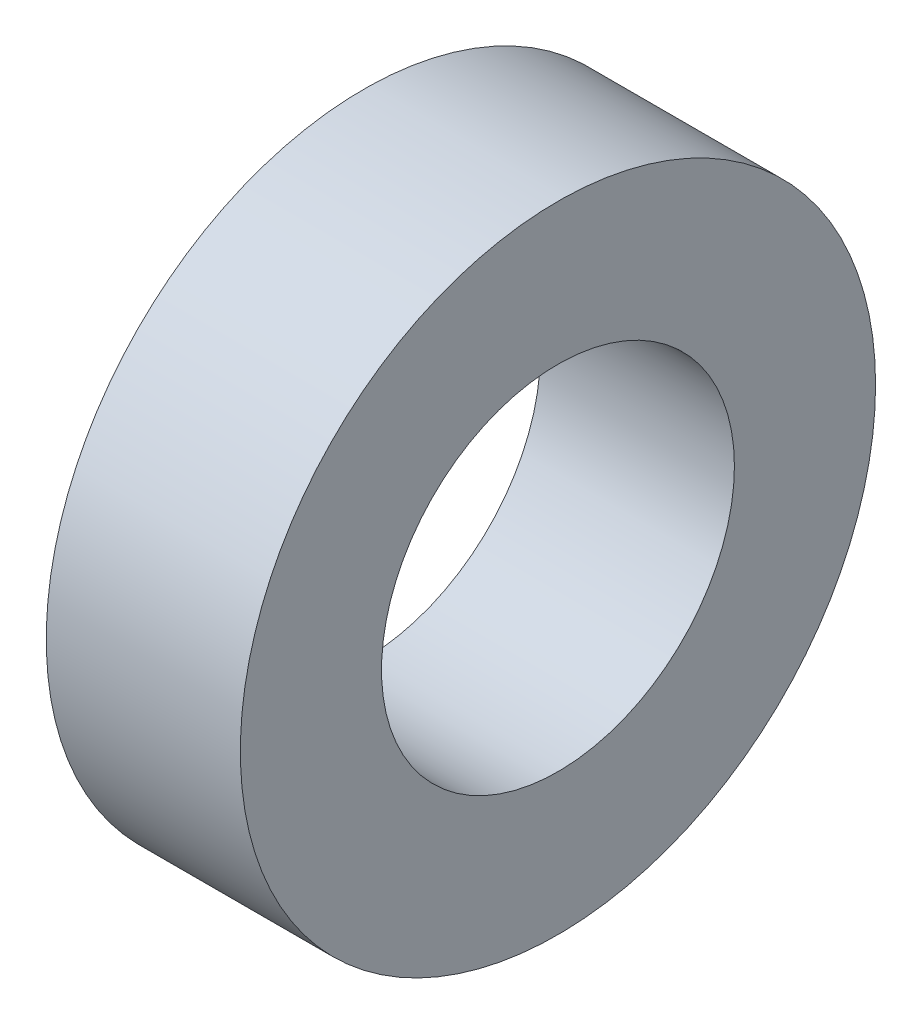
ISO-10303-21;
HEADER;
FILE_DESCRIPTION(('STEP AP214'),'2;1');
FILE_NAME('part.step','',(''),(''),'','','');
FILE_SCHEMA(('AUTOMOTIVE_DESIGN { 1 0 10303 214 1 1 1 1 }'));
ENDSEC;
DATA;
#1=APPLICATION_CONTEXT('core data for automotive mechanical design processes');
#2=APPLICATION_PROTOCOL_DEFINITION('international standard','automotive_design',2000,#1);
#3=PRODUCT_CONTEXT('',#1,'mechanical');
#4=PRODUCT('Part','Part','',(#3));
#5=PRODUCT_RELATED_PRODUCT_CATEGORY('part','',(#4));
#6=PRODUCT_DEFINITION_FORMATION('','',#4);
#7=PRODUCT_DEFINITION_CONTEXT('part definition',#1,'design');
#8=PRODUCT_DEFINITION('design','',#6,#7);
#9=PRODUCT_DEFINITION_SHAPE('','',#8);
#10=(LENGTH_UNIT() NAMED_UNIT(*) SI_UNIT(.MILLI.,.METRE.));
#11=(NAMED_UNIT(*) PLANE_ANGLE_UNIT() SI_UNIT($,.RADIAN.));
#12=(NAMED_UNIT(*) SI_UNIT($,.STERADIAN.) SOLID_ANGLE_UNIT());
#13=UNCERTAINTY_MEASURE_WITH_UNIT(LENGTH_MEASURE(1.E-05),#10,'distance_accuracy_value','');
#14=(GEOMETRIC_REPRESENTATION_CONTEXT(3) GLOBAL_UNCERTAINTY_ASSIGNED_CONTEXT((#13)) GLOBAL_UNIT_ASSIGNED_CONTEXT((#10,
#11,#12)) REPRESENTATION_CONTEXT('',''));
#15=CARTESIAN_POINT('',(0.,0.,0.));
#16=DIRECTION('',(0.,0.,1.));
#17=DIRECTION('',(1.,0.,0.));
#18=AXIS2_PLACEMENT_3D('',#15,#16,#17);
#19=CARTESIAN_POINT('',(-4.9,-1.4,0.));
#20=DIRECTION('',(-1.,0.,0.));
#21=DIRECTION('',(0.,0.,1.));
#22=AXIS2_PLACEMENT_3D('',#19,#20,#21);
#23=PLANE('',#22);
#24=CARTESIAN_POINT('',(-4.9,0.,0.));
#25=DIRECTION('',(1.,0.,0.));
#26=DIRECTION('',(0.,0.,-1.));
#27=AXIS2_PLACEMENT_3D('',#24,#25,#26);
#28=CIRCLE('',#27,1.8);
#29=CARTESIAN_POINT('',(-4.9,0.,-1.8));
#30=VERTEX_POINT('',#29);
#31=EDGE_CURVE('E17',#30,#30,#28,.T.);
#32=ORIENTED_EDGE('',*,*,#31,.F.);
#33=EDGE_LOOP('',(#32));
#34=FACE_BOUND('',#33,.T.);
#35=CARTESIAN_POINT('',(-4.9,0.,0.));
#36=DIRECTION('',(1.,0.,0.));
#37=DIRECTION('',(0.,0.,-1.));
#38=AXIS2_PLACEMENT_3D('',#35,#36,#37);
#39=CIRCLE('',#38,1.);
#40=CARTESIAN_POINT('',(-4.9,0.,-1.));
#41=VERTEX_POINT('',#40);
#42=EDGE_CURVE('E26',#41,#41,#39,.T.);
#43=ORIENTED_EDGE('',*,*,#42,.T.);
#44=EDGE_LOOP('',(#43));
#45=FACE_BOUND('',#44,.T.);
#46=ADVANCED_FACE('F14',(#34,#45),#23,.T.);
#47=CARTESIAN_POINT('',(-4.35,0.,0.));
#48=DIRECTION('',(1.,0.,0.));
#49=DIRECTION('',(0.,0.,-1.));
#50=AXIS2_PLACEMENT_3D('',#47,#48,#49);
#51=CYLINDRICAL_SURFACE('',#50,1.8);
#52=ORIENTED_EDGE('',*,*,#31,.T.);
#53=EDGE_LOOP('',(#52));
#54=FACE_BOUND('',#53,.T.);
#55=CARTESIAN_POINT('',(-3.8,0.,0.));
#56=DIRECTION('',(1.,0.,0.));
#57=DIRECTION('',(0.,0.,-1.));
#58=AXIS2_PLACEMENT_3D('',#55,#56,#57);
#59=CIRCLE('',#58,1.8);
#60=CARTESIAN_POINT('',(-3.8,0.,-1.8));
#61=VERTEX_POINT('',#60);
#62=EDGE_CURVE('E21',#61,#61,#59,.T.);
#63=ORIENTED_EDGE('',*,*,#62,.F.);
#64=EDGE_LOOP('',(#63));
#65=FACE_BOUND('',#64,.T.);
#66=ADVANCED_FACE('F34',(#54,#65),#51,.T.);
#67=CARTESIAN_POINT('',(-4.35,0.,0.));
#68=DIRECTION('',(1.,0.,0.));
#69=DIRECTION('',(0.,0.,-1.));
#70=AXIS2_PLACEMENT_3D('',#67,#68,#69);
#71=CYLINDRICAL_SURFACE('',#70,1.);
#72=CARTESIAN_POINT('',(-3.8,0.,0.));
#73=DIRECTION('',(1.,0.,0.));
#74=DIRECTION('',(0.,0.,-1.));
#75=AXIS2_PLACEMENT_3D('',#72,#73,#74);
#76=CIRCLE('',#75,1.);
#77=CARTESIAN_POINT('',(-3.8,0.,-1.));
#78=VERTEX_POINT('',#77);
#79=EDGE_CURVE('E10',#78,#78,#76,.F.);
#80=ORIENTED_EDGE('',*,*,#79,.F.);
#81=EDGE_LOOP('',(#80));
#82=FACE_BOUND('',#81,.T.);
#83=ORIENTED_EDGE('',*,*,#42,.F.);
#84=EDGE_LOOP('',(#83));
#85=FACE_BOUND('',#84,.T.);
#86=ADVANCED_FACE('F42',(#82,#85),#71,.F.);
#87=CARTESIAN_POINT('',(-3.8,-1.4,0.));
#88=DIRECTION('',(1.,0.,0.));
#89=DIRECTION('',(0.,0.,-1.));
#90=AXIS2_PLACEMENT_3D('',#87,#88,#89);
#91=PLANE('',#90);
#92=ORIENTED_EDGE('',*,*,#79,.T.);
#93=EDGE_LOOP('',(#92));
#94=FACE_BOUND('',#93,.T.);
#95=ORIENTED_EDGE('',*,*,#62,.T.);
#96=EDGE_LOOP('',(#95));
#97=FACE_BOUND('',#96,.T.);
#98=ADVANCED_FACE('F43',(#94,#97),#91,.T.);
#99=CLOSED_SHELL('',(#46,#66,#86,#98));
#100=MANIFOLD_SOLID_BREP('B1',#99);
#101=ADVANCED_BREP_SHAPE_REPRESENTATION('',(#18,#100),#14);
#102=SHAPE_DEFINITION_REPRESENTATION(#9,#101);
ENDSEC;
END-ISO-10303-21;
